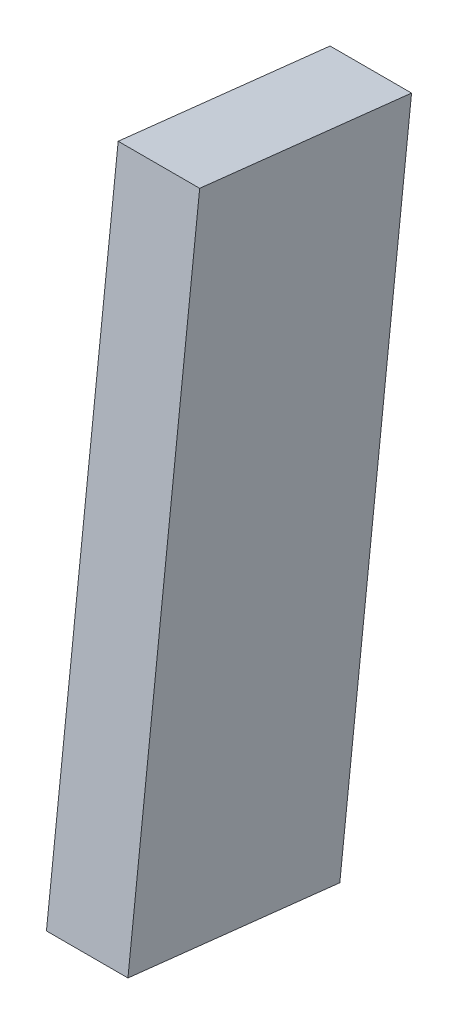
ISO-10303-21;
HEADER;
FILE_DESCRIPTION(('STEP AP214'),'2;1');
FILE_NAME('part.step','',(''),(''),'','','');
FILE_SCHEMA(('AUTOMOTIVE_DESIGN { 1 0 10303 214 1 1 1 1 }'));
ENDSEC;
DATA;
#1=APPLICATION_CONTEXT('core data for automotive mechanical design processes');
#2=APPLICATION_PROTOCOL_DEFINITION('international standard','automotive_design',2000,#1);
#3=PRODUCT_CONTEXT('',#1,'mechanical');
#4=PRODUCT('Part','Part','',(#3));
#5=PRODUCT_RELATED_PRODUCT_CATEGORY('part','',(#4));
#6=PRODUCT_DEFINITION_FORMATION('','',#4);
#7=PRODUCT_DEFINITION_CONTEXT('part definition',#1,'design');
#8=PRODUCT_DEFINITION('design','',#6,#7);
#9=PRODUCT_DEFINITION_SHAPE('','',#8);
#10=(LENGTH_UNIT() NAMED_UNIT(*) SI_UNIT(.MILLI.,.METRE.));
#11=(NAMED_UNIT(*) PLANE_ANGLE_UNIT() SI_UNIT($,.RADIAN.));
#12=(NAMED_UNIT(*) SI_UNIT($,.STERADIAN.) SOLID_ANGLE_UNIT());
#13=UNCERTAINTY_MEASURE_WITH_UNIT(LENGTH_MEASURE(1.E-05),#10,'distance_accuracy_value','');
#14=(GEOMETRIC_REPRESENTATION_CONTEXT(3) GLOBAL_UNCERTAINTY_ASSIGNED_CONTEXT((#13)) GLOBAL_UNIT_ASSIGNED_CONTEXT((#10,
#11,#12)) REPRESENTATION_CONTEXT('',''));
#15=CARTESIAN_POINT('',(0.,0.,0.));
#16=DIRECTION('',(0.,0.,1.));
#17=DIRECTION('',(1.,0.,0.));
#18=AXIS2_PLACEMENT_3D('',#15,#16,#17);
#19=CARTESIAN_POINT('',(-1559.66413309407,412.819017174781,1161.02210896562));
#20=DIRECTION('',(0.,0.110032184815467,0.993928024710409));
#21=DIRECTION('',(0.,-0.993928024710409,0.110032184815467));
#22=AXIS2_PLACEMENT_3D('',#19,#20,#21);
#23=PLANE('',#22);
#24=DIRECTION('',(0.,0.993928024710409,-0.110032184815467));
#25=VECTOR('',#24,1.);
#26=CARTESIAN_POINT('',(-1564.66413309407,412.819017174781,1161.02210896562));
#27=LINE('',#26,#25);
#28=CARTESIAN_POINT('',(-1564.66413309407,373.061896186364,1165.42339635824));
#29=VERTEX_POINT('',#28);
#30=CARTESIAN_POINT('',(-1564.66413309407,412.819017174781,1161.02210896562));
#31=VERTEX_POINT('',#30);
#32=EDGE_CURVE('E102',#29,#31,#27,.T.);
#33=ORIENTED_EDGE('',*,*,#32,.T.);
#34=DIRECTION('',(-1.,0.,0.));
#35=VECTOR('',#34,1.);
#36=CARTESIAN_POINT('',(-1559.66413309407,412.819017174781,1161.02210896562));
#37=LINE('',#36,#35);
#38=CARTESIAN_POINT('',(-1559.66413309407,412.819017174781,1161.02210896562));
#39=VERTEX_POINT('',#38);
#40=EDGE_CURVE('E11',#39,#31,#37,.T.);
#41=ORIENTED_EDGE('',*,*,#40,.F.);
#42=DIRECTION('',(0.,0.993928024710409,-0.110032184815467));
#43=VECTOR('',#42,1.);
#44=CARTESIAN_POINT('',(-1559.66413309407,412.819017174781,1161.02210896562));
#45=LINE('',#44,#43);
#46=CARTESIAN_POINT('',(-1559.66413309407,373.061896186364,1165.42339635824));
#47=VERTEX_POINT('',#46);
#48=EDGE_CURVE('E90',#47,#39,#45,.T.);
#49=ORIENTED_EDGE('',*,*,#48,.F.);
#50=DIRECTION('',(-1.,0.,0.));
#51=VECTOR('',#50,1.);
#52=CARTESIAN_POINT('',(-1559.66413309407,373.061896186364,1165.42339635824));
#53=LINE('',#52,#51);
#54=EDGE_CURVE('E98',#47,#29,#53,.T.);
#55=ORIENTED_EDGE('',*,*,#54,.T.);
#56=EDGE_LOOP('',(#33,#41,#49,#55));
#57=FACE_BOUND('',#56,.T.);
#58=ADVANCED_FACE('F39',(#57),#23,.F.);
#59=CARTESIAN_POINT('',(-1559.66413309407,412.819017174781,1161.02210896562));
#60=DIRECTION('',(0.,-0.993928024710409,0.110032184815467));
#61=DIRECTION('',(0.,-0.110032184815467,-0.993928024710409));
#62=AXIS2_PLACEMENT_3D('',#59,#60,#61);
#63=PLANE('',#62);
#64=DIRECTION('',(0.,0.110032184815467,0.993928024710409));
#65=VECTOR('',#64,1.);
#66=CARTESIAN_POINT('',(-1564.66413309407,412.819017174781,1161.02210896562));
#67=LINE('',#66,#65);
#68=CARTESIAN_POINT('',(-1564.66413309407,414.258174102686,1174.02210896562));
#69=VERTEX_POINT('',#68);
#70=EDGE_CURVE('E94',#31,#69,#67,.T.);
#71=ORIENTED_EDGE('',*,*,#70,.T.);
#72=DIRECTION('',(-1.,0.,0.));
#73=VECTOR('',#72,1.);
#74=CARTESIAN_POINT('',(-1559.66413309407,414.258174102686,1174.02210896562));
#75=LINE('',#74,#73);
#76=CARTESIAN_POINT('',(-1559.66413309407,414.258174102686,1174.02210896562));
#77=VERTEX_POINT('',#76);
#78=EDGE_CURVE('E47',#77,#69,#75,.T.);
#79=ORIENTED_EDGE('',*,*,#78,.F.);
#80=DIRECTION('',(0.,0.110032184815467,0.993928024710409));
#81=VECTOR('',#80,1.);
#82=CARTESIAN_POINT('',(-1559.66413309407,412.819017174781,1161.02210896562));
#83=LINE('',#82,#81);
#84=EDGE_CURVE('E85',#39,#77,#83,.T.);
#85=ORIENTED_EDGE('',*,*,#84,.F.);
#86=ORIENTED_EDGE('',*,*,#40,.T.);
#87=EDGE_LOOP('',(#71,#79,#85,#86));
#88=FACE_BOUND('',#87,.T.);
#89=ADVANCED_FACE('F93',(#88),#63,.F.);
#90=CARTESIAN_POINT('',(-1559.66413309407,414.258174102686,1174.02210896562));
#91=DIRECTION('',(0.,-0.110032184815462,-0.993928024710409));
#92=DIRECTION('',(0.,0.993928024710409,-0.110032184815462));
#93=AXIS2_PLACEMENT_3D('',#90,#91,#92);
#94=PLANE('',#93);
#95=DIRECTION('',(0.,-0.993928024710409,0.110032184815462));
#96=VECTOR('',#95,1.);
#97=CARTESIAN_POINT('',(-1564.66413309407,414.258174102686,1174.02210896562));
#98=LINE('',#97,#96);
#99=CARTESIAN_POINT('',(-1564.66413309407,374.501053114269,1178.42339635824));
#100=VERTEX_POINT('',#99);
#101=EDGE_CURVE('E72',#69,#100,#98,.T.);
#102=ORIENTED_EDGE('',*,*,#101,.T.);
#103=DIRECTION('',(-1.,0.,0.));
#104=VECTOR('',#103,1.);
#105=CARTESIAN_POINT('',(-1559.66413309407,374.501053114269,1178.42339635824));
#106=LINE('',#105,#104);
#107=CARTESIAN_POINT('',(-1559.66413309407,374.501053114269,1178.42339635824));
#108=VERTEX_POINT('',#107);
#109=EDGE_CURVE('E95',#108,#100,#106,.T.);
#110=ORIENTED_EDGE('',*,*,#109,.F.);
#111=DIRECTION('',(0.,-0.993928024710409,0.110032184815462));
#112=VECTOR('',#111,1.);
#113=CARTESIAN_POINT('',(-1559.66413309407,414.258174102686,1174.02210896562));
#114=LINE('',#113,#112);
#115=EDGE_CURVE('E88',#77,#108,#114,.T.);
#116=ORIENTED_EDGE('',*,*,#115,.F.);
#117=ORIENTED_EDGE('',*,*,#78,.T.);
#118=EDGE_LOOP('',(#102,#110,#116,#117));
#119=FACE_BOUND('',#118,.T.);
#120=ADVANCED_FACE('F96',(#119),#94,.F.);
#121=CARTESIAN_POINT('',(-1559.66413309407,373.061896186364,1165.42339635824));
#122=DIRECTION('',(0.,0.993928024710409,-0.110032184815468));
#123=DIRECTION('',(0.,0.110032184815468,0.993928024710409));
#124=AXIS2_PLACEMENT_3D('',#121,#122,#123);
#125=PLANE('',#124);
#126=DIRECTION('',(0.,-0.110032184815468,-0.993928024710409));
#127=VECTOR('',#126,1.);
#128=CARTESIAN_POINT('',(-1564.66413309407,373.061896186364,1165.42339635824));
#129=LINE('',#128,#127);
#130=EDGE_CURVE('E78',#100,#29,#129,.T.);
#131=ORIENTED_EDGE('',*,*,#130,.T.);
#132=ORIENTED_EDGE('',*,*,#54,.F.);
#133=DIRECTION('',(0.,-0.110032184815468,-0.993928024710409));
#134=VECTOR('',#133,1.);
#135=CARTESIAN_POINT('',(-1559.66413309407,373.061896186364,1165.42339635824));
#136=LINE('',#135,#134);
#137=EDGE_CURVE('E55',#108,#47,#136,.T.);
#138=ORIENTED_EDGE('',*,*,#137,.F.);
#139=ORIENTED_EDGE('',*,*,#109,.T.);
#140=EDGE_LOOP('',(#131,#132,#138,#139));
#141=FACE_BOUND('',#140,.T.);
#142=ADVANCED_FACE('F109',(#141),#125,.F.);
#143=CARTESIAN_POINT('',(-1559.66413309407,0.,0.));
#144=DIRECTION('',(-1.,0.,0.));
#145=DIRECTION('',(0.,0.,1.));
#146=AXIS2_PLACEMENT_3D('',#143,#144,#145);
#147=PLANE('',#146);
#148=ORIENTED_EDGE('',*,*,#48,.T.);
#149=ORIENTED_EDGE('',*,*,#84,.T.);
#150=ORIENTED_EDGE('',*,*,#115,.T.);
#151=ORIENTED_EDGE('',*,*,#137,.T.);
#152=EDGE_LOOP('',(#148,#149,#150,#151));
#153=FACE_BOUND('',#152,.T.);
#154=ADVANCED_FACE('F86',(#153),#147,.F.);
#155=CARTESIAN_POINT('',(-1564.66413309407,0.,0.));
#156=DIRECTION('',(-1.,0.,0.));
#157=DIRECTION('',(0.,0.,1.));
#158=AXIS2_PLACEMENT_3D('',#155,#156,#157);
#159=PLANE('',#158);
#160=ORIENTED_EDGE('',*,*,#32,.F.);
#161=ORIENTED_EDGE('',*,*,#130,.F.);
#162=ORIENTED_EDGE('',*,*,#101,.F.);
#163=ORIENTED_EDGE('',*,*,#70,.F.);
#164=EDGE_LOOP('',(#160,#161,#162,#163));
#165=FACE_BOUND('',#164,.T.);
#166=ADVANCED_FACE('F112',(#165),#159,.T.);
#167=CLOSED_SHELL('',(#58,#89,#120,#142,#154,#166));
#168=MANIFOLD_SOLID_BREP('B2',#167);
#169=ADVANCED_BREP_SHAPE_REPRESENTATION('',(#18,#168),#14);
#170=SHAPE_DEFINITION_REPRESENTATION(#9,#169);
ENDSEC;
END-ISO-10303-21;
